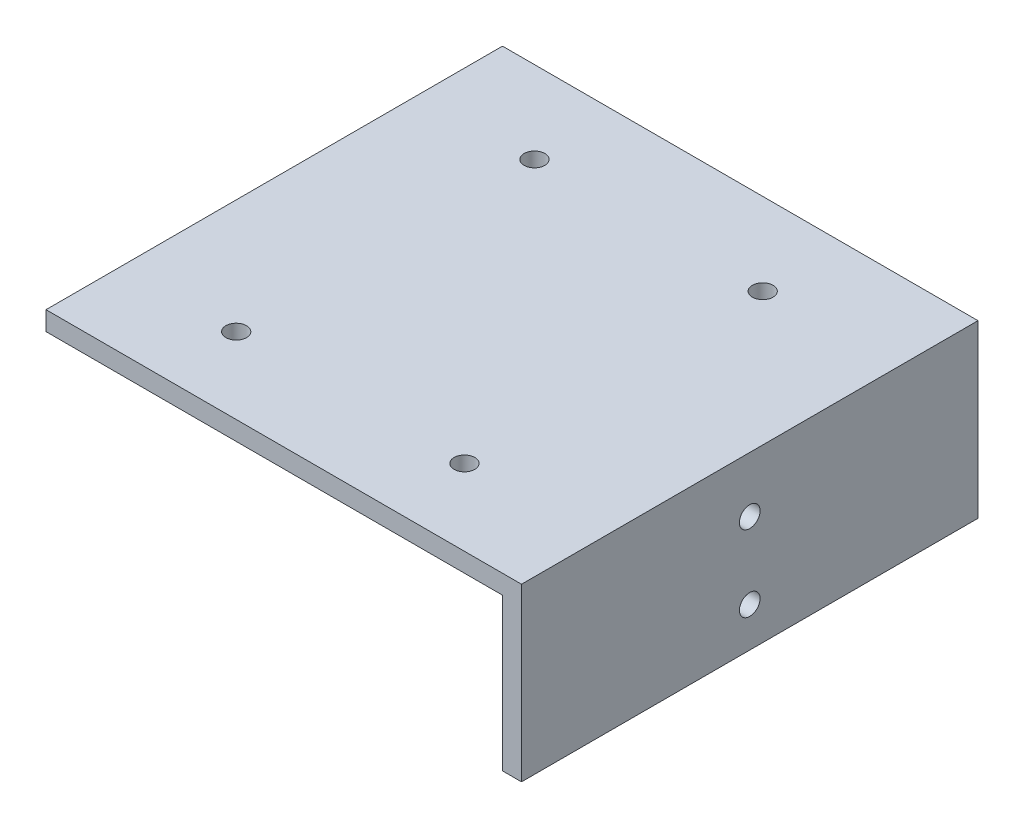
ISO-10303-21;
HEADER;
FILE_DESCRIPTION(('STEP AP214'),'2;1');
FILE_NAME('part.step','',(''),(''),'','','');
FILE_SCHEMA(('AUTOMOTIVE_DESIGN { 1 0 10303 214 1 1 1 1 }'));
ENDSEC;
DATA;
#1=APPLICATION_CONTEXT('core data for automotive mechanical design processes');
#2=APPLICATION_PROTOCOL_DEFINITION('international standard','automotive_design',2000,#1);
#3=PRODUCT_CONTEXT('',#1,'mechanical');
#4=PRODUCT('Part','Part','',(#3));
#5=PRODUCT_RELATED_PRODUCT_CATEGORY('part','',(#4));
#6=PRODUCT_DEFINITION_FORMATION('','',#4);
#7=PRODUCT_DEFINITION_CONTEXT('part definition',#1,'design');
#8=PRODUCT_DEFINITION('design','',#6,#7);
#9=PRODUCT_DEFINITION_SHAPE('','',#8);
#10=(LENGTH_UNIT() NAMED_UNIT(*) SI_UNIT(.MILLI.,.METRE.));
#11=(NAMED_UNIT(*) PLANE_ANGLE_UNIT() SI_UNIT($,.RADIAN.));
#12=(NAMED_UNIT(*) SI_UNIT($,.STERADIAN.) SOLID_ANGLE_UNIT());
#13=UNCERTAINTY_MEASURE_WITH_UNIT(LENGTH_MEASURE(1.E-05),#10,'distance_accuracy_value','');
#14=(GEOMETRIC_REPRESENTATION_CONTEXT(3) GLOBAL_UNCERTAINTY_ASSIGNED_CONTEXT((#13)) GLOBAL_UNIT_ASSIGNED_CONTEXT((#10,
#11,#12)) REPRESENTATION_CONTEXT('',''));
#15=CARTESIAN_POINT('',(0.,0.,0.));
#16=DIRECTION('',(0.,0.,1.));
#17=DIRECTION('',(1.,0.,0.));
#18=AXIS2_PLACEMENT_3D('',#15,#16,#17);
#19=CARTESIAN_POINT('',(-3.175,0.,76.2));
#20=DIRECTION('',(0.,1.,0.));
#21=DIRECTION('',(0.,0.,1.));
#22=AXIS2_PLACEMENT_3D('',#19,#20,#21);
#23=PLANE('',#22);
#24=DIRECTION('',(1.,0.,0.));
#25=VECTOR('',#24,1.);
#26=CARTESIAN_POINT('',(-3.175,0.,0.));
#27=LINE('',#26,#25);
#28=CARTESIAN_POINT('',(-3.175,0.,0.));
#29=VERTEX_POINT('',#28);
#30=CARTESIAN_POINT('',(0.,0.,0.));
#31=VERTEX_POINT('',#30);
#32=EDGE_CURVE('E119',#29,#31,#27,.T.);
#33=ORIENTED_EDGE('',*,*,#32,.T.);
#34=DIRECTION('',(0.,0.,-1.));
#35=VECTOR('',#34,1.);
#36=CARTESIAN_POINT('',(0.,0.,76.2));
#37=LINE('',#36,#35);
#38=CARTESIAN_POINT('',(0.,0.,76.2));
#39=VERTEX_POINT('',#38);
#40=EDGE_CURVE('E11',#39,#31,#37,.T.);
#41=ORIENTED_EDGE('',*,*,#40,.F.);
#42=DIRECTION('',(1.,0.,0.));
#43=VECTOR('',#42,1.);
#44=CARTESIAN_POINT('',(-3.175,0.,76.2));
#45=LINE('',#44,#43);
#46=CARTESIAN_POINT('',(-3.175,0.,76.2));
#47=VERTEX_POINT('',#46);
#48=EDGE_CURVE('E130',#47,#39,#45,.T.);
#49=ORIENTED_EDGE('',*,*,#48,.F.);
#50=DIRECTION('',(0.,0.,-1.));
#51=VECTOR('',#50,1.);
#52=CARTESIAN_POINT('',(-3.175,0.,76.2));
#53=LINE('',#52,#51);
#54=EDGE_CURVE('E115',#47,#29,#53,.T.);
#55=ORIENTED_EDGE('',*,*,#54,.T.);
#56=EDGE_LOOP('',(#33,#41,#49,#55));
#57=FACE_BOUND('',#56,.T.);
#58=ADVANCED_FACE('F35',(#57),#23,.F.);
#59=CARTESIAN_POINT('',(0.,0.,76.2));
#60=DIRECTION('',(-1.,0.,0.));
#61=DIRECTION('',(0.,0.,1.));
#62=AXIS2_PLACEMENT_3D('',#59,#60,#61);
#63=PLANE('',#62);
#64=CARTESIAN_POINT('',(0.,6.60000000000019,38.100000000001));
#65=DIRECTION('',(-1.,0.,0.));
#66=DIRECTION('',(0.,0.,1.));
#67=AXIS2_PLACEMENT_3D('',#64,#65,#66);
#68=CIRCLE('',#67,1.72719999999999);
#69=CARTESIAN_POINT('',(0.,6.60000000000019,39.827200000001));
#70=VERTEX_POINT('',#69);
#71=EDGE_CURVE('E283',#70,#70,#68,.T.);
#72=ORIENTED_EDGE('',*,*,#71,.T.);
#73=EDGE_LOOP('',(#72));
#74=FACE_BOUND('',#73,.T.);
#75=CARTESIAN_POINT('',(0.,19.3000000000002,38.100000000001));
#76=DIRECTION('',(-1.,0.,0.));
#77=DIRECTION('',(0.,0.,1.));
#78=AXIS2_PLACEMENT_3D('',#75,#76,#77);
#79=CIRCLE('',#78,1.72719999999999);
#80=CARTESIAN_POINT('',(0.,19.3000000000002,39.827200000001));
#81=VERTEX_POINT('',#80);
#82=EDGE_CURVE('E123',#81,#81,#79,.T.);
#83=ORIENTED_EDGE('',*,*,#82,.T.);
#84=EDGE_LOOP('',(#83));
#85=FACE_BOUND('',#84,.T.);
#86=DIRECTION('',(0.,1.,0.));
#87=VECTOR('',#86,1.);
#88=CARTESIAN_POINT('',(0.,0.,0.));
#89=LINE('',#88,#87);
#90=CARTESIAN_POINT('',(0.,28.575,0.));
#91=VERTEX_POINT('',#90);
#92=EDGE_CURVE('E122',#31,#91,#89,.T.);
#93=ORIENTED_EDGE('',*,*,#92,.T.);
#94=DIRECTION('',(0.,0.,-1.));
#95=VECTOR('',#94,1.);
#96=CARTESIAN_POINT('',(0.,28.575,76.2));
#97=LINE('',#96,#95);
#98=CARTESIAN_POINT('',(0.,28.575,76.2));
#99=VERTEX_POINT('',#98);
#100=EDGE_CURVE('E43',#99,#91,#97,.T.);
#101=ORIENTED_EDGE('',*,*,#100,.F.);
#102=DIRECTION('',(0.,1.,0.));
#103=VECTOR('',#102,1.);
#104=CARTESIAN_POINT('',(0.,0.,76.2));
#105=LINE('',#104,#103);
#106=EDGE_CURVE('E88',#39,#99,#105,.T.);
#107=ORIENTED_EDGE('',*,*,#106,.F.);
#108=ORIENTED_EDGE('',*,*,#40,.T.);
#109=EDGE_LOOP('',(#93,#101,#107,#108));
#110=FACE_BOUND('',#109,.T.);
#111=ADVANCED_FACE('F158',(#74,#85,#110),#63,.F.);
#112=CARTESIAN_POINT('',(0.,28.575,76.2));
#113=DIRECTION('',(0.,-1.,0.));
#114=DIRECTION('',(1.,0.,0.));
#115=AXIS2_PLACEMENT_3D('',#112,#113,#114);
#116=PLANE('',#115);
#117=CARTESIAN_POINT('',(-60.325,28.575,63.5));
#118=DIRECTION('',(0.,-1.,0.));
#119=DIRECTION('',(1.,0.,0.));
#120=AXIS2_PLACEMENT_3D('',#117,#118,#119);
#121=CIRCLE('',#120,1.72719999999999);
#122=CARTESIAN_POINT('',(-58.5978,28.575,63.5));
#123=VERTEX_POINT('',#122);
#124=EDGE_CURVE('E311',#123,#123,#121,.T.);
#125=ORIENTED_EDGE('',*,*,#124,.T.);
#126=EDGE_LOOP('',(#125));
#127=FACE_BOUND('',#126,.T.);
#128=CARTESIAN_POINT('',(-22.225,28.575,63.5));
#129=DIRECTION('',(0.,-1.,0.));
#130=DIRECTION('',(1.,0.,0.));
#131=AXIS2_PLACEMENT_3D('',#128,#129,#130);
#132=CIRCLE('',#131,1.72719999999999);
#133=CARTESIAN_POINT('',(-20.4978,28.575,63.5));
#134=VERTEX_POINT('',#133);
#135=EDGE_CURVE('E305',#134,#134,#132,.T.);
#136=ORIENTED_EDGE('',*,*,#135,.T.);
#137=EDGE_LOOP('',(#136));
#138=FACE_BOUND('',#137,.T.);
#139=CARTESIAN_POINT('',(-60.325,28.575,13.7115939046919));
#140=DIRECTION('',(0.,-1.,0.));
#141=DIRECTION('',(1.,0.,0.));
#142=AXIS2_PLACEMENT_3D('',#139,#140,#141);
#143=CIRCLE('',#142,1.72719999999999);
#144=CARTESIAN_POINT('',(-58.5978,28.575,13.7115939046919));
#145=VERTEX_POINT('',#144);
#146=EDGE_CURVE('E299',#145,#145,#143,.T.);
#147=ORIENTED_EDGE('',*,*,#146,.T.);
#148=EDGE_LOOP('',(#147));
#149=FACE_BOUND('',#148,.T.);
#150=CARTESIAN_POINT('',(-22.225,28.575,13.7115939046919));
#151=DIRECTION('',(0.,-1.,0.));
#152=DIRECTION('',(1.,0.,0.));
#153=AXIS2_PLACEMENT_3D('',#150,#151,#152);
#154=CIRCLE('',#153,1.72719999999999);
#155=CARTESIAN_POINT('',(-20.4978,28.575,13.7115939046919));
#156=VERTEX_POINT('',#155);
#157=EDGE_CURVE('E293',#156,#156,#154,.T.);
#158=ORIENTED_EDGE('',*,*,#157,.T.);
#159=EDGE_LOOP('',(#158));
#160=FACE_BOUND('',#159,.T.);
#161=DIRECTION('',(-1.,0.,0.));
#162=VECTOR('',#161,1.);
#163=CARTESIAN_POINT('',(0.,28.575,0.));
#164=LINE('',#163,#162);
#165=CARTESIAN_POINT('',(-79.375,28.575,0.));
#166=VERTEX_POINT('',#165);
#167=EDGE_CURVE('E125',#91,#166,#164,.T.);
#168=ORIENTED_EDGE('',*,*,#167,.T.);
#169=DIRECTION('',(0.,0.,-1.));
#170=VECTOR('',#169,1.);
#171=CARTESIAN_POINT('',(-79.375,28.575,76.2));
#172=LINE('',#171,#170);
#173=CARTESIAN_POINT('',(-79.375,28.575,76.2));
#174=VERTEX_POINT('',#173);
#175=EDGE_CURVE('E110',#174,#166,#172,.T.);
#176=ORIENTED_EDGE('',*,*,#175,.F.);
#177=DIRECTION('',(-1.,0.,0.));
#178=VECTOR('',#177,1.);
#179=CARTESIAN_POINT('',(0.,28.575,76.2));
#180=LINE('',#179,#178);
#181=EDGE_CURVE('E101',#99,#174,#180,.T.);
#182=ORIENTED_EDGE('',*,*,#181,.F.);
#183=ORIENTED_EDGE('',*,*,#100,.T.);
#184=EDGE_LOOP('',(#168,#176,#182,#183));
#185=FACE_BOUND('',#184,.T.);
#186=ADVANCED_FACE('F136',(#127,#138,#149,#160,#185),#116,.F.);
#187=CARTESIAN_POINT('',(-79.375,28.575,76.2));
#188=DIRECTION('',(1.,0.,0.));
#189=DIRECTION('',(0.,0.,-1.));
#190=AXIS2_PLACEMENT_3D('',#187,#188,#189);
#191=PLANE('',#190);
#192=DIRECTION('',(0.,-1.,0.));
#193=VECTOR('',#192,1.);
#194=CARTESIAN_POINT('',(-79.375,28.575,0.));
#195=LINE('',#194,#193);
#196=CARTESIAN_POINT('',(-79.375,25.4,0.));
#197=VERTEX_POINT('',#196);
#198=EDGE_CURVE('E109',#166,#197,#195,.T.);
#199=ORIENTED_EDGE('',*,*,#198,.T.);
#200=DIRECTION('',(0.,0.,-1.));
#201=VECTOR('',#200,1.);
#202=CARTESIAN_POINT('',(-79.375,25.4,76.2));
#203=LINE('',#202,#201);
#204=CARTESIAN_POINT('',(-79.375,25.4,76.2));
#205=VERTEX_POINT('',#204);
#206=EDGE_CURVE('E106',#205,#197,#203,.T.);
#207=ORIENTED_EDGE('',*,*,#206,.F.);
#208=DIRECTION('',(0.,-1.,0.));
#209=VECTOR('',#208,1.);
#210=CARTESIAN_POINT('',(-79.375,28.575,76.2));
#211=LINE('',#210,#209);
#212=EDGE_CURVE('E95',#174,#205,#211,.T.);
#213=ORIENTED_EDGE('',*,*,#212,.F.);
#214=ORIENTED_EDGE('',*,*,#175,.T.);
#215=EDGE_LOOP('',(#199,#207,#213,#214));
#216=FACE_BOUND('',#215,.T.);
#217=ADVANCED_FACE('F107',(#216),#191,.F.);
#218=CARTESIAN_POINT('',(-79.375,25.4,76.2));
#219=DIRECTION('',(0.,1.,0.));
#220=DIRECTION('',(0.,0.,1.));
#221=AXIS2_PLACEMENT_3D('',#218,#219,#220);
#222=PLANE('',#221);
#223=CARTESIAN_POINT('',(-60.325,25.4,63.5));
#224=DIRECTION('',(0.,-1.,0.));
#225=DIRECTION('',(0.,0.,-1.));
#226=AXIS2_PLACEMENT_3D('',#223,#224,#225);
#227=CIRCLE('',#226,1.72719999999998);
#228=CARTESIAN_POINT('',(-60.325,25.4,61.7728));
#229=VERTEX_POINT('',#228);
#230=EDGE_CURVE('E314',#229,#229,#227,.T.);
#231=ORIENTED_EDGE('',*,*,#230,.F.);
#232=EDGE_LOOP('',(#231));
#233=FACE_BOUND('',#232,.T.);
#234=CARTESIAN_POINT('',(-22.225,25.4,63.5));
#235=DIRECTION('',(0.,-1.,0.));
#236=DIRECTION('',(0.,0.,-1.));
#237=AXIS2_PLACEMENT_3D('',#234,#235,#236);
#238=CIRCLE('',#237,1.72719999999999);
#239=CARTESIAN_POINT('',(-22.225,25.4,61.7728));
#240=VERTEX_POINT('',#239);
#241=EDGE_CURVE('E308',#240,#240,#238,.T.);
#242=ORIENTED_EDGE('',*,*,#241,.F.);
#243=EDGE_LOOP('',(#242));
#244=FACE_BOUND('',#243,.T.);
#245=CARTESIAN_POINT('',(-60.325,25.4,13.7115939046919));
#246=DIRECTION('',(0.,-1.,0.));
#247=DIRECTION('',(0.,0.,-1.));
#248=AXIS2_PLACEMENT_3D('',#245,#246,#247);
#249=CIRCLE('',#248,1.72719999999998);
#250=CARTESIAN_POINT('',(-60.325,25.4,11.9843939046919));
#251=VERTEX_POINT('',#250);
#252=EDGE_CURVE('E302',#251,#251,#249,.T.);
#253=ORIENTED_EDGE('',*,*,#252,.F.);
#254=EDGE_LOOP('',(#253));
#255=FACE_BOUND('',#254,.T.);
#256=CARTESIAN_POINT('',(-22.225,25.4,13.7115939046919));
#257=DIRECTION('',(0.,-1.,0.));
#258=DIRECTION('',(0.,0.,-1.));
#259=AXIS2_PLACEMENT_3D('',#256,#257,#258);
#260=CIRCLE('',#259,1.72719999999999);
#261=CARTESIAN_POINT('',(-22.225,25.4,11.9843939046919));
#262=VERTEX_POINT('',#261);
#263=EDGE_CURVE('E296',#262,#262,#260,.T.);
#264=ORIENTED_EDGE('',*,*,#263,.F.);
#265=EDGE_LOOP('',(#264));
#266=FACE_BOUND('',#265,.T.);
#267=DIRECTION('',(1.,0.,0.));
#268=VECTOR('',#267,1.);
#269=CARTESIAN_POINT('',(-79.375,25.4,0.));
#270=LINE('',#269,#268);
#271=CARTESIAN_POINT('',(-3.175,25.4,0.));
#272=VERTEX_POINT('',#271);
#273=EDGE_CURVE('E74',#197,#272,#270,.T.);
#274=ORIENTED_EDGE('',*,*,#273,.T.);
#275=DIRECTION('',(0.,0.,-1.));
#276=VECTOR('',#275,1.);
#277=CARTESIAN_POINT('',(-3.175,25.4,76.2));
#278=LINE('',#277,#276);
#279=CARTESIAN_POINT('',(-3.175,25.4,76.2));
#280=VERTEX_POINT('',#279);
#281=EDGE_CURVE('E111',#280,#272,#278,.T.);
#282=ORIENTED_EDGE('',*,*,#281,.F.);
#283=DIRECTION('',(1.,0.,0.));
#284=VECTOR('',#283,1.);
#285=CARTESIAN_POINT('',(-79.375,25.4,76.2));
#286=LINE('',#285,#284);
#287=EDGE_CURVE('E99',#205,#280,#286,.T.);
#288=ORIENTED_EDGE('',*,*,#287,.F.);
#289=ORIENTED_EDGE('',*,*,#206,.T.);
#290=EDGE_LOOP('',(#274,#282,#288,#289));
#291=FACE_BOUND('',#290,.T.);
#292=ADVANCED_FACE('F113',(#233,#244,#255,#266,#291),#222,.F.);
#293=CARTESIAN_POINT('',(-3.175,25.4,76.2));
#294=DIRECTION('',(1.,0.,0.));
#295=DIRECTION('',(0.,1.,0.));
#296=AXIS2_PLACEMENT_3D('',#293,#294,#295);
#297=PLANE('',#296);
#298=CARTESIAN_POINT('',(-3.175,6.60000000000019,38.100000000001));
#299=DIRECTION('',(-1.,0.,0.));
#300=DIRECTION('',(0.,0.,1.));
#301=AXIS2_PLACEMENT_3D('',#298,#299,#300);
#302=CIRCLE('',#301,1.72719999999999);
#303=CARTESIAN_POINT('',(-3.175,6.60000000000019,39.8272000000009));
#304=VERTEX_POINT('',#303);
#305=EDGE_CURVE('E286',#304,#304,#302,.T.);
#306=ORIENTED_EDGE('',*,*,#305,.F.);
#307=EDGE_LOOP('',(#306));
#308=FACE_BOUND('',#307,.T.);
#309=CARTESIAN_POINT('',(-3.175,19.3000000000002,38.100000000001));
#310=DIRECTION('',(-1.,0.,0.));
#311=DIRECTION('',(0.,0.,1.));
#312=AXIS2_PLACEMENT_3D('',#309,#310,#311);
#313=CIRCLE('',#312,1.72719999999999);
#314=CARTESIAN_POINT('',(-3.175,19.3000000000002,39.8272000000009));
#315=VERTEX_POINT('',#314);
#316=EDGE_CURVE('E282',#315,#315,#313,.T.);
#317=ORIENTED_EDGE('',*,*,#316,.F.);
#318=EDGE_LOOP('',(#317));
#319=FACE_BOUND('',#318,.T.);
#320=DIRECTION('',(0.,-1.,0.));
#321=VECTOR('',#320,1.);
#322=CARTESIAN_POINT('',(-3.175,25.4,0.));
#323=LINE('',#322,#321);
#324=EDGE_CURVE('E80',#272,#29,#323,.T.);
#325=ORIENTED_EDGE('',*,*,#324,.T.);
#326=ORIENTED_EDGE('',*,*,#54,.F.);
#327=DIRECTION('',(0.,-1.,0.));
#328=VECTOR('',#327,1.);
#329=CARTESIAN_POINT('',(-3.175,25.4,76.2));
#330=LINE('',#329,#328);
#331=EDGE_CURVE('E51',#280,#47,#330,.T.);
#332=ORIENTED_EDGE('',*,*,#331,.F.);
#333=ORIENTED_EDGE('',*,*,#281,.T.);
#334=EDGE_LOOP('',(#325,#326,#332,#333));
#335=FACE_BOUND('',#334,.T.);
#336=ADVANCED_FACE('F143',(#308,#319,#335),#297,.F.);
#337=CARTESIAN_POINT('',(0.,0.,76.2));
#338=DIRECTION('',(0.,0.,1.));
#339=DIRECTION('',(1.,0.,0.));
#340=AXIS2_PLACEMENT_3D('',#337,#338,#339);
#341=PLANE('',#340);
#342=ORIENTED_EDGE('',*,*,#48,.T.);
#343=ORIENTED_EDGE('',*,*,#106,.T.);
#344=ORIENTED_EDGE('',*,*,#181,.T.);
#345=ORIENTED_EDGE('',*,*,#212,.T.);
#346=ORIENTED_EDGE('',*,*,#287,.T.);
#347=ORIENTED_EDGE('',*,*,#331,.T.);
#348=EDGE_LOOP('',(#342,#343,#344,#345,#346,#347));
#349=FACE_BOUND('',#348,.T.);
#350=ADVANCED_FACE('F97',(#349),#341,.T.);
#351=CARTESIAN_POINT('',(0.,0.,0.));
#352=DIRECTION('',(0.,0.,1.));
#353=DIRECTION('',(1.,0.,0.));
#354=AXIS2_PLACEMENT_3D('',#351,#352,#353);
#355=PLANE('',#354);
#356=ORIENTED_EDGE('',*,*,#32,.F.);
#357=ORIENTED_EDGE('',*,*,#324,.F.);
#358=ORIENTED_EDGE('',*,*,#273,.F.);
#359=ORIENTED_EDGE('',*,*,#198,.F.);
#360=ORIENTED_EDGE('',*,*,#167,.F.);
#361=ORIENTED_EDGE('',*,*,#92,.F.);
#362=EDGE_LOOP('',(#356,#357,#358,#359,#360,#361));
#363=FACE_BOUND('',#362,.T.);
#364=ADVANCED_FACE('F139',(#363),#355,.F.);
#365=CARTESIAN_POINT('',(-3.175,19.3000000000002,38.100000000001));
#366=DIRECTION('',(-1.,0.,0.));
#367=DIRECTION('',(0.,0.,1.));
#368=AXIS2_PLACEMENT_3D('',#365,#366,#367);
#369=CYLINDRICAL_SURFACE('',#368,1.72719999999999);
#370=ORIENTED_EDGE('',*,*,#82,.F.);
#371=EDGE_LOOP('',(#370));
#372=FACE_BOUND('',#371,.T.);
#373=ORIENTED_EDGE('',*,*,#316,.T.);
#374=EDGE_LOOP('',(#373));
#375=FACE_BOUND('',#374,.T.);
#376=ADVANCED_FACE('F236',(#372,#375),#369,.F.);
#377=CARTESIAN_POINT('',(-3.175,6.60000000000019,38.100000000001));
#378=DIRECTION('',(-1.,0.,0.));
#379=DIRECTION('',(0.,0.,1.));
#380=AXIS2_PLACEMENT_3D('',#377,#378,#379);
#381=CYLINDRICAL_SURFACE('',#380,1.72719999999999);
#382=ORIENTED_EDGE('',*,*,#71,.F.);
#383=EDGE_LOOP('',(#382));
#384=FACE_BOUND('',#383,.T.);
#385=ORIENTED_EDGE('',*,*,#305,.T.);
#386=EDGE_LOOP('',(#385));
#387=FACE_BOUND('',#386,.T.);
#388=ADVANCED_FACE('F196',(#384,#387),#381,.F.);
#389=CARTESIAN_POINT('',(-22.225,25.4,13.7115939046919));
#390=DIRECTION('',(0.,-1.,0.));
#391=DIRECTION('',(0.,0.,-1.));
#392=AXIS2_PLACEMENT_3D('',#389,#390,#391);
#393=CYLINDRICAL_SURFACE('',#392,1.72719999999999);
#394=ORIENTED_EDGE('',*,*,#157,.F.);
#395=EDGE_LOOP('',(#394));
#396=FACE_BOUND('',#395,.T.);
#397=ORIENTED_EDGE('',*,*,#263,.T.);
#398=EDGE_LOOP('',(#397));
#399=FACE_BOUND('',#398,.T.);
#400=ADVANCED_FACE('F190',(#396,#399),#393,.F.);
#401=CARTESIAN_POINT('',(-60.325,25.4,13.7115939046919));
#402=DIRECTION('',(0.,-1.,0.));
#403=DIRECTION('',(0.,0.,-1.));
#404=AXIS2_PLACEMENT_3D('',#401,#402,#403);
#405=CYLINDRICAL_SURFACE('',#404,1.72719999999999);
#406=ORIENTED_EDGE('',*,*,#146,.F.);
#407=EDGE_LOOP('',(#406));
#408=FACE_BOUND('',#407,.T.);
#409=ORIENTED_EDGE('',*,*,#252,.T.);
#410=EDGE_LOOP('',(#409));
#411=FACE_BOUND('',#410,.T.);
#412=ADVANCED_FACE('F195',(#408,#411),#405,.F.);
#413=CARTESIAN_POINT('',(-22.225,25.4,63.5));
#414=DIRECTION('',(0.,-1.,0.));
#415=DIRECTION('',(0.,0.,-1.));
#416=AXIS2_PLACEMENT_3D('',#413,#414,#415);
#417=CYLINDRICAL_SURFACE('',#416,1.72719999999999);
#418=ORIENTED_EDGE('',*,*,#135,.F.);
#419=EDGE_LOOP('',(#418));
#420=FACE_BOUND('',#419,.T.);
#421=ORIENTED_EDGE('',*,*,#241,.T.);
#422=EDGE_LOOP('',(#421));
#423=FACE_BOUND('',#422,.T.);
#424=ADVANCED_FACE('F208',(#420,#423),#417,.F.);
#425=CARTESIAN_POINT('',(-60.325,25.4,63.5));
#426=DIRECTION('',(0.,-1.,0.));
#427=DIRECTION('',(0.,0.,-1.));
#428=AXIS2_PLACEMENT_3D('',#425,#426,#427);
#429=CYLINDRICAL_SURFACE('',#428,1.72719999999999);
#430=ORIENTED_EDGE('',*,*,#124,.F.);
#431=EDGE_LOOP('',(#430));
#432=FACE_BOUND('',#431,.T.);
#433=ORIENTED_EDGE('',*,*,#230,.T.);
#434=EDGE_LOOP('',(#433));
#435=FACE_BOUND('',#434,.T.);
#436=ADVANCED_FACE('F218',(#432,#435),#429,.F.);
#437=CLOSED_SHELL('',(#58,#111,#186,#217,#292,#336,#350,#364,#376,#388,#400,#412,#424,#436));
#438=MANIFOLD_SOLID_BREP('B2',#437);
#439=ADVANCED_BREP_SHAPE_REPRESENTATION('',(#18,#438),#14);
#440=SHAPE_DEFINITION_REPRESENTATION(#9,#439);
ENDSEC;
END-ISO-10303-21;
